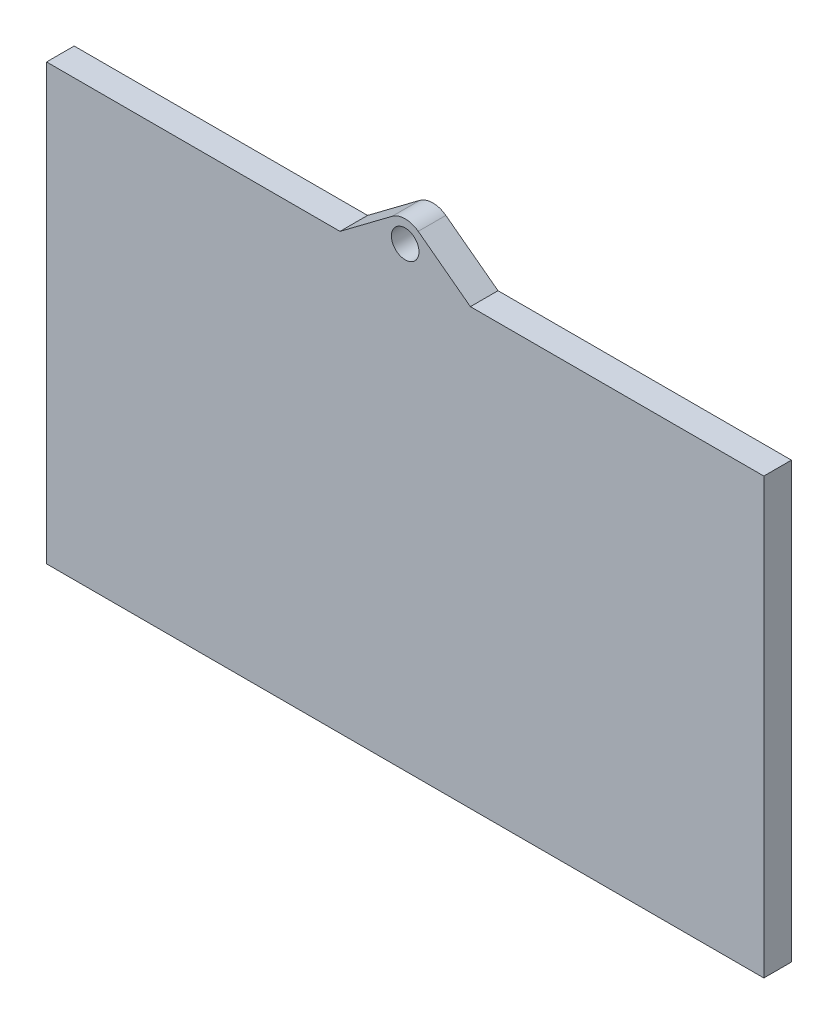
ISO-10303-21;
HEADER;
FILE_DESCRIPTION(('STEP AP214'),'2;1');
FILE_NAME('part.step','',(''),(''),'','','');
FILE_SCHEMA(('AUTOMOTIVE_DESIGN { 1 0 10303 214 1 1 1 1 }'));
ENDSEC;
DATA;
#1=APPLICATION_CONTEXT('core data for automotive mechanical design processes');
#2=APPLICATION_PROTOCOL_DEFINITION('international standard','automotive_design',2000,#1);
#3=PRODUCT_CONTEXT('',#1,'mechanical');
#4=PRODUCT('Part','Part','',(#3));
#5=PRODUCT_RELATED_PRODUCT_CATEGORY('part','',(#4));
#6=PRODUCT_DEFINITION_FORMATION('','',#4);
#7=PRODUCT_DEFINITION_CONTEXT('part definition',#1,'design');
#8=PRODUCT_DEFINITION('design','',#6,#7);
#9=PRODUCT_DEFINITION_SHAPE('','',#8);
#10=(LENGTH_UNIT() NAMED_UNIT(*) SI_UNIT(.MILLI.,.METRE.));
#11=(NAMED_UNIT(*) PLANE_ANGLE_UNIT() SI_UNIT($,.RADIAN.));
#12=(NAMED_UNIT(*) SI_UNIT($,.STERADIAN.) SOLID_ANGLE_UNIT());
#13=UNCERTAINTY_MEASURE_WITH_UNIT(LENGTH_MEASURE(1.E-05),#10,'distance_accuracy_value','');
#14=(GEOMETRIC_REPRESENTATION_CONTEXT(3) GLOBAL_UNCERTAINTY_ASSIGNED_CONTEXT((#13)) GLOBAL_UNIT_ASSIGNED_CONTEXT((#10,
#11,#12)) REPRESENTATION_CONTEXT('',''));
#15=CARTESIAN_POINT('',(0.,0.,0.));
#16=DIRECTION('',(0.,0.,1.));
#17=DIRECTION('',(1.,0.,0.));
#18=AXIS2_PLACEMENT_3D('',#15,#16,#17);
#19=CARTESIAN_POINT('',(-82.5,50.,6.35));
#20=DIRECTION('',(0.,-1.,0.));
#21=DIRECTION('',(0.,0.,-1.));
#22=AXIS2_PLACEMENT_3D('',#19,#20,#21);
#23=PLANE('',#22);
#24=DIRECTION('',(0.,0.,1.));
#25=VECTOR('',#24,1.);
#26=CARTESIAN_POINT('',(-15.,50.,-31.6227766016838));
#27=LINE('',#26,#25);
#28=CARTESIAN_POINT('',(-15.,50.,0.));
#29=VERTEX_POINT('',#28);
#30=CARTESIAN_POINT('',(-15.,50.,6.35));
#31=VERTEX_POINT('',#30);
#32=EDGE_CURVE('E64',#29,#31,#27,.T.);
#33=ORIENTED_EDGE('',*,*,#32,.F.);
#34=DIRECTION('',(-1.,0.,0.));
#35=VECTOR('',#34,1.);
#36=CARTESIAN_POINT('',(-82.5,50.,0.));
#37=LINE('',#36,#35);
#38=CARTESIAN_POINT('',(-82.5,50.,0.));
#39=VERTEX_POINT('',#38);
#40=EDGE_CURVE('E162',#29,#39,#37,.T.);
#41=ORIENTED_EDGE('',*,*,#40,.T.);
#42=DIRECTION('',(0.,0.,-1.));
#43=VECTOR('',#42,1.);
#44=CARTESIAN_POINT('',(-82.5,50.,6.35));
#45=LINE('',#44,#43);
#46=CARTESIAN_POINT('',(-82.5,50.,6.35));
#47=VERTEX_POINT('',#46);
#48=EDGE_CURVE('E48',#47,#39,#45,.T.);
#49=ORIENTED_EDGE('',*,*,#48,.F.);
#50=DIRECTION('',(-1.,0.,0.));
#51=VECTOR('',#50,1.);
#52=CARTESIAN_POINT('',(-82.5,50.,6.35));
#53=LINE('',#52,#51);
#54=EDGE_CURVE('E151',#31,#47,#53,.T.);
#55=ORIENTED_EDGE('',*,*,#54,.F.);
#56=EDGE_LOOP('',(#33,#41,#49,#55));
#57=FACE_BOUND('',#56,.T.);
#58=ADVANCED_FACE('F39',(#57),#23,.F.);
#59=CARTESIAN_POINT('',(82.5,50.,6.35));
#60=DIRECTION('',(-1.,0.,0.));
#61=DIRECTION('',(0.,0.,1.));
#62=AXIS2_PLACEMENT_3D('',#59,#60,#61);
#63=PLANE('',#62);
#64=DIRECTION('',(0.,1.,0.));
#65=VECTOR('',#64,1.);
#66=CARTESIAN_POINT('',(82.5,50.,0.));
#67=LINE('',#66,#65);
#68=CARTESIAN_POINT('',(82.5,-50.,0.));
#69=VERTEX_POINT('',#68);
#70=CARTESIAN_POINT('',(82.5,50.,0.));
#71=VERTEX_POINT('',#70);
#72=EDGE_CURVE('E148',#69,#71,#67,.T.);
#73=ORIENTED_EDGE('',*,*,#72,.T.);
#74=DIRECTION('',(0.,0.,-1.));
#75=VECTOR('',#74,1.);
#76=CARTESIAN_POINT('',(82.5,50.,6.35));
#77=LINE('',#76,#75);
#78=CARTESIAN_POINT('',(82.5,50.,6.35));
#79=VERTEX_POINT('',#78);
#80=EDGE_CURVE('E11',#79,#71,#77,.T.);
#81=ORIENTED_EDGE('',*,*,#80,.F.);
#82=DIRECTION('',(0.,1.,0.));
#83=VECTOR('',#82,1.);
#84=CARTESIAN_POINT('',(82.5,50.,6.35));
#85=LINE('',#84,#83);
#86=CARTESIAN_POINT('',(82.5,-50.,6.35));
#87=VERTEX_POINT('',#86);
#88=EDGE_CURVE('E149',#87,#79,#85,.T.);
#89=ORIENTED_EDGE('',*,*,#88,.F.);
#90=DIRECTION('',(0.,0.,-1.));
#91=VECTOR('',#90,1.);
#92=CARTESIAN_POINT('',(82.5,-50.,6.35));
#93=LINE('',#92,#91);
#94=EDGE_CURVE('E173',#87,#69,#93,.T.);
#95=ORIENTED_EDGE('',*,*,#94,.T.);
#96=EDGE_LOOP('',(#73,#81,#89,#95));
#97=FACE_BOUND('',#96,.T.);
#98=ADVANCED_FACE('F41',(#97),#63,.F.);
#99=CARTESIAN_POINT('',(15.,50.,0.));
#100=VERTEX_POINT('',#99);
#101=EDGE_CURVE('E165',#71,#100,#37,.T.);
#102=ORIENTED_EDGE('',*,*,#101,.T.);
#103=DIRECTION('',(0.,0.,1.));
#104=VECTOR('',#103,1.);
#105=CARTESIAN_POINT('',(15.,50.,-31.6227766016838));
#106=LINE('',#105,#104);
#107=CARTESIAN_POINT('',(15.,50.,6.35));
#108=VERTEX_POINT('',#107);
#109=EDGE_CURVE('E56',#100,#108,#106,.T.);
#110=ORIENTED_EDGE('',*,*,#109,.T.);
#111=EDGE_CURVE('E132',#79,#108,#53,.T.);
#112=ORIENTED_EDGE('',*,*,#111,.F.);
#113=ORIENTED_EDGE('',*,*,#80,.T.);
#114=EDGE_LOOP('',(#102,#110,#112,#113));
#115=FACE_BOUND('',#114,.T.);
#116=ADVANCED_FACE('F216',(#115),#23,.F.);
#117=CARTESIAN_POINT('',(-82.5,50.,6.35));
#118=DIRECTION('',(1.,0.,0.));
#119=DIRECTION('',(0.,1.,0.));
#120=AXIS2_PLACEMENT_3D('',#117,#118,#119);
#121=PLANE('',#120);
#122=DIRECTION('',(0.,-1.,0.));
#123=VECTOR('',#122,1.);
#124=CARTESIAN_POINT('',(-82.5,50.,0.));
#125=LINE('',#124,#123);
#126=CARTESIAN_POINT('',(-82.5,-50.,0.));
#127=VERTEX_POINT('',#126);
#128=EDGE_CURVE('E169',#39,#127,#125,.T.);
#129=ORIENTED_EDGE('',*,*,#128,.T.);
#130=DIRECTION('',(0.,0.,-1.));
#131=VECTOR('',#130,1.);
#132=CARTESIAN_POINT('',(-82.5,-50.,6.35));
#133=LINE('',#132,#131);
#134=CARTESIAN_POINT('',(-82.5,-50.,6.35));
#135=VERTEX_POINT('',#134);
#136=EDGE_CURVE('E176',#135,#127,#133,.T.);
#137=ORIENTED_EDGE('',*,*,#136,.F.);
#138=DIRECTION('',(0.,-1.,0.));
#139=VECTOR('',#138,1.);
#140=CARTESIAN_POINT('',(-82.5,50.,6.35));
#141=LINE('',#140,#139);
#142=EDGE_CURVE('E155',#47,#135,#141,.T.);
#143=ORIENTED_EDGE('',*,*,#142,.F.);
#144=ORIENTED_EDGE('',*,*,#48,.T.);
#145=EDGE_LOOP('',(#129,#137,#143,#144));
#146=FACE_BOUND('',#145,.T.);
#147=ADVANCED_FACE('F185',(#146),#121,.F.);
#148=CARTESIAN_POINT('',(-82.5,-50.,6.35));
#149=DIRECTION('',(0.,1.,0.));
#150=DIRECTION('',(0.,0.,1.));
#151=AXIS2_PLACEMENT_3D('',#148,#149,#150);
#152=PLANE('',#151);
#153=DIRECTION('',(1.,0.,0.));
#154=VECTOR('',#153,1.);
#155=CARTESIAN_POINT('',(-82.5,-50.,0.));
#156=LINE('',#155,#154);
#157=EDGE_CURVE('E152',#127,#69,#156,.T.);
#158=ORIENTED_EDGE('',*,*,#157,.T.);
#159=ORIENTED_EDGE('',*,*,#94,.F.);
#160=DIRECTION('',(1.,0.,0.));
#161=VECTOR('',#160,1.);
#162=CARTESIAN_POINT('',(-82.5,-50.,6.35));
#163=LINE('',#162,#161);
#164=EDGE_CURVE('E177',#135,#87,#163,.T.);
#165=ORIENTED_EDGE('',*,*,#164,.F.);
#166=ORIENTED_EDGE('',*,*,#136,.T.);
#167=EDGE_LOOP('',(#158,#159,#165,#166));
#168=FACE_BOUND('',#167,.T.);
#169=ADVANCED_FACE('F196',(#168),#152,.F.);
#170=CARTESIAN_POINT('',(0.,0.,6.35));
#171=DIRECTION('',(0.,0.,1.));
#172=DIRECTION('',(1.,0.,0.));
#173=AXIS2_PLACEMENT_3D('',#170,#171,#172);
#174=PLANE('',#173);
#175=ORIENTED_EDGE('',*,*,#88,.T.);
#176=ORIENTED_EDGE('',*,*,#111,.T.);
#177=DIRECTION('',(-0.8,0.6,0.));
#178=VECTOR('',#177,1.);
#179=CARTESIAN_POINT('',(3.00000000000001,59.,6.35));
#180=LINE('',#179,#178);
#181=CARTESIAN_POINT('',(3.00000000000001,59.,6.35));
#182=VERTEX_POINT('',#181);
#183=EDGE_CURVE('E112',#108,#182,#180,.T.);
#184=ORIENTED_EDGE('',*,*,#183,.T.);
#185=CARTESIAN_POINT('',(0.,55.,6.35));
#186=DIRECTION('',(0.,0.,1.));
#187=DIRECTION('',(1.,0.,0.));
#188=AXIS2_PLACEMENT_3D('',#185,#186,#187);
#189=CIRCLE('',#188,5.00000000000001);
#190=CARTESIAN_POINT('',(-3.00000000000001,59.,6.35));
#191=VERTEX_POINT('',#190);
#192=EDGE_CURVE('E120',#182,#191,#189,.T.);
#193=ORIENTED_EDGE('',*,*,#192,.T.);
#194=DIRECTION('',(-0.8,-0.6,0.));
#195=VECTOR('',#194,1.);
#196=CARTESIAN_POINT('',(-3.,59.,6.35));
#197=LINE('',#196,#195);
#198=EDGE_CURVE('E127',#191,#31,#197,.T.);
#199=ORIENTED_EDGE('',*,*,#198,.T.);
#200=ORIENTED_EDGE('',*,*,#54,.T.);
#201=ORIENTED_EDGE('',*,*,#142,.T.);
#202=ORIENTED_EDGE('',*,*,#164,.T.);
#203=EDGE_LOOP('',(#175,#176,#184,#193,#199,#200,#201,#202));
#204=FACE_BOUND('',#203,.T.);
#205=CARTESIAN_POINT('',(0.,55.,6.35));
#206=DIRECTION('',(0.,0.,1.));
#207=DIRECTION('',(1.,0.,0.));
#208=AXIS2_PLACEMENT_3D('',#205,#206,#207);
#209=CIRCLE('',#208,3.175);
#210=CARTESIAN_POINT('',(3.175,55.,6.35));
#211=VERTEX_POINT('',#210);
#212=EDGE_CURVE('E133',#211,#211,#209,.T.);
#213=ORIENTED_EDGE('',*,*,#212,.F.);
#214=EDGE_LOOP('',(#213));
#215=FACE_BOUND('',#214,.T.);
#216=ADVANCED_FACE('F130',(#204,#215),#174,.T.);
#217=CARTESIAN_POINT('',(0.,0.,0.));
#218=DIRECTION('',(0.,0.,1.));
#219=DIRECTION('',(1.,0.,0.));
#220=AXIS2_PLACEMENT_3D('',#217,#218,#219);
#221=PLANE('',#220);
#222=ORIENTED_EDGE('',*,*,#72,.F.);
#223=ORIENTED_EDGE('',*,*,#157,.F.);
#224=ORIENTED_EDGE('',*,*,#128,.F.);
#225=ORIENTED_EDGE('',*,*,#40,.F.);
#226=DIRECTION('',(0.8,0.6,0.));
#227=VECTOR('',#226,1.);
#228=CARTESIAN_POINT('',(-3.,59.,0.));
#229=LINE('',#228,#227);
#230=CARTESIAN_POINT('',(-3.00000000000001,59.,0.));
#231=VERTEX_POINT('',#230);
#232=EDGE_CURVE('E203',#29,#231,#229,.T.);
#233=ORIENTED_EDGE('',*,*,#232,.T.);
#234=CARTESIAN_POINT('',(0.,55.,0.));
#235=DIRECTION('',(0.,0.,1.));
#236=DIRECTION('',(1.,0.,0.));
#237=AXIS2_PLACEMENT_3D('',#234,#235,#236);
#238=CIRCLE('',#237,5.00000000000001);
#239=CARTESIAN_POINT('',(3.00000000000001,59.,0.));
#240=VERTEX_POINT('',#239);
#241=EDGE_CURVE('E204',#231,#240,#238,.F.);
#242=ORIENTED_EDGE('',*,*,#241,.T.);
#243=DIRECTION('',(0.8,-0.6,0.));
#244=VECTOR('',#243,1.);
#245=CARTESIAN_POINT('',(3.00000000000001,59.,0.));
#246=LINE('',#245,#244);
#247=EDGE_CURVE('E114',#240,#100,#246,.T.);
#248=ORIENTED_EDGE('',*,*,#247,.T.);
#249=ORIENTED_EDGE('',*,*,#101,.F.);
#250=EDGE_LOOP('',(#222,#223,#224,#225,#233,#242,#248,#249));
#251=FACE_BOUND('',#250,.T.);
#252=CARTESIAN_POINT('',(0.,55.,0.));
#253=DIRECTION('',(0.,0.,1.));
#254=DIRECTION('',(1.,0.,0.));
#255=AXIS2_PLACEMENT_3D('',#252,#253,#254);
#256=CIRCLE('',#255,3.175);
#257=CARTESIAN_POINT('',(3.175,55.,0.));
#258=VERTEX_POINT('',#257);
#259=EDGE_CURVE('E145',#258,#258,#256,.F.);
#260=ORIENTED_EDGE('',*,*,#259,.F.);
#261=EDGE_LOOP('',(#260));
#262=FACE_BOUND('',#261,.T.);
#263=ADVANCED_FACE('F190',(#251,#262),#221,.F.);
#264=CARTESIAN_POINT('',(3.00000000000001,59.,-31.6227766016838));
#265=DIRECTION('',(0.6,0.8,0.));
#266=DIRECTION('',(-0.8,0.6,0.));
#267=AXIS2_PLACEMENT_3D('',#264,#265,#266);
#268=PLANE('',#267);
#269=ORIENTED_EDGE('',*,*,#247,.F.);
#270=DIRECTION('',(0.,0.,1.));
#271=VECTOR('',#270,1.);
#272=CARTESIAN_POINT('',(3.00000000000001,59.,-31.6227766016838));
#273=LINE('',#272,#271);
#274=EDGE_CURVE('E108',#240,#182,#273,.T.);
#275=ORIENTED_EDGE('',*,*,#274,.T.);
#276=ORIENTED_EDGE('',*,*,#183,.F.);
#277=ORIENTED_EDGE('',*,*,#109,.F.);
#278=EDGE_LOOP('',(#269,#275,#276,#277));
#279=FACE_BOUND('',#278,.T.);
#280=ADVANCED_FACE('F110',(#279),#268,.T.);
#281=CARTESIAN_POINT('',(0.,55.,-31.6227766016838));
#282=DIRECTION('',(0.,0.,1.));
#283=DIRECTION('',(1.,0.,0.));
#284=AXIS2_PLACEMENT_3D('',#281,#282,#283);
#285=CYLINDRICAL_SURFACE('',#284,5.00000000000001);
#286=ORIENTED_EDGE('',*,*,#241,.F.);
#287=DIRECTION('',(0.,0.,1.));
#288=VECTOR('',#287,1.);
#289=CARTESIAN_POINT('',(-3.00000000000001,59.,-31.6227766016838));
#290=LINE('',#289,#288);
#291=EDGE_CURVE('E117',#231,#191,#290,.T.);
#292=ORIENTED_EDGE('',*,*,#291,.T.);
#293=ORIENTED_EDGE('',*,*,#192,.F.);
#294=ORIENTED_EDGE('',*,*,#274,.F.);
#295=EDGE_LOOP('',(#286,#292,#293,#294));
#296=FACE_BOUND('',#295,.T.);
#297=ADVANCED_FACE('F121',(#296),#285,.T.);
#298=CARTESIAN_POINT('',(-3.,59.,-31.6227766016838));
#299=DIRECTION('',(-0.6,0.8,0.));
#300=DIRECTION('',(-0.8,-0.6,0.));
#301=AXIS2_PLACEMENT_3D('',#298,#299,#300);
#302=PLANE('',#301);
#303=ORIENTED_EDGE('',*,*,#232,.F.);
#304=ORIENTED_EDGE('',*,*,#32,.T.);
#305=ORIENTED_EDGE('',*,*,#198,.F.);
#306=ORIENTED_EDGE('',*,*,#291,.F.);
#307=EDGE_LOOP('',(#303,#304,#305,#306));
#308=FACE_BOUND('',#307,.T.);
#309=ADVANCED_FACE('F202',(#308),#302,.T.);
#310=CARTESIAN_POINT('',(0.,55.,-31.6227766016838));
#311=DIRECTION('',(0.,0.,1.));
#312=DIRECTION('',(1.,0.,0.));
#313=AXIS2_PLACEMENT_3D('',#310,#311,#312);
#314=CYLINDRICAL_SURFACE('',#313,3.175);
#315=ORIENTED_EDGE('',*,*,#259,.T.);
#316=EDGE_LOOP('',(#315));
#317=FACE_BOUND('',#316,.T.);
#318=ORIENTED_EDGE('',*,*,#212,.T.);
#319=EDGE_LOOP('',(#318));
#320=FACE_BOUND('',#319,.T.);
#321=ADVANCED_FACE('F283',(#317,#320),#314,.F.);
#322=CLOSED_SHELL('',(#58,#98,#116,#147,#169,#216,#263,#280,#297,#309,#321));
#323=MANIFOLD_SOLID_BREP('B2',#322);
#324=ADVANCED_BREP_SHAPE_REPRESENTATION('',(#18,#323),#14);
#325=SHAPE_DEFINITION_REPRESENTATION(#9,#324);
ENDSEC;
END-ISO-10303-21;
